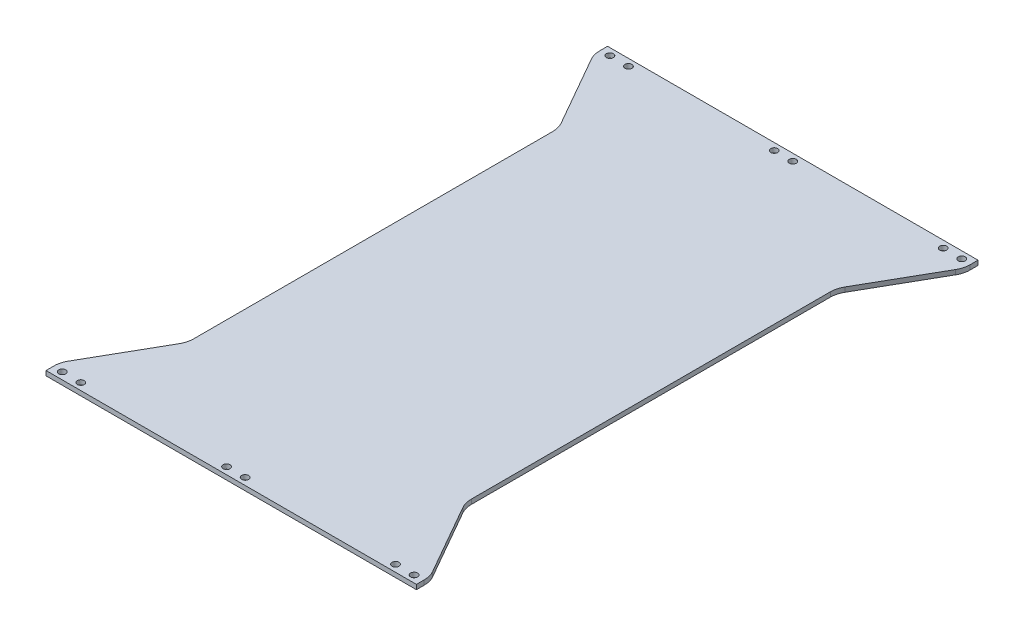
ISO-10303-21;
HEADER;
FILE_DESCRIPTION(('STEP AP214'),'2;1');
FILE_NAME('part.step','',(''),(''),'','','');
FILE_SCHEMA(('AUTOMOTIVE_DESIGN { 1 0 10303 214 1 1 1 1 }'));
ENDSEC;
DATA;
#1=APPLICATION_CONTEXT('core data for automotive mechanical design processes');
#2=APPLICATION_PROTOCOL_DEFINITION('international standard','automotive_design',2000,#1);
#3=PRODUCT_CONTEXT('',#1,'mechanical');
#4=PRODUCT('Part','Part','',(#3));
#5=PRODUCT_RELATED_PRODUCT_CATEGORY('part','',(#4));
#6=PRODUCT_DEFINITION_FORMATION('','',#4);
#7=PRODUCT_DEFINITION_CONTEXT('part definition',#1,'design');
#8=PRODUCT_DEFINITION('design','',#6,#7);
#9=PRODUCT_DEFINITION_SHAPE('','',#8);
#10=(LENGTH_UNIT() NAMED_UNIT(*) SI_UNIT(.MILLI.,.METRE.));
#11=(NAMED_UNIT(*) PLANE_ANGLE_UNIT() SI_UNIT($,.RADIAN.));
#12=(NAMED_UNIT(*) SI_UNIT($,.STERADIAN.) SOLID_ANGLE_UNIT());
#13=UNCERTAINTY_MEASURE_WITH_UNIT(LENGTH_MEASURE(1.E-05),#10,'distance_accuracy_value','');
#14=(GEOMETRIC_REPRESENTATION_CONTEXT(3) GLOBAL_UNCERTAINTY_ASSIGNED_CONTEXT((#13)) GLOBAL_UNIT_ASSIGNED_CONTEXT((#10,
#11,#12)) REPRESENTATION_CONTEXT('',''));
#15=CARTESIAN_POINT('',(0.,0.,0.));
#16=DIRECTION('',(0.,0.,1.));
#17=DIRECTION('',(1.,0.,0.));
#18=AXIS2_PLACEMENT_3D('',#15,#16,#17);
#19=CARTESIAN_POINT('',(0.,2.,0.));
#20=DIRECTION('',(0.,-1.,0.));
#21=DIRECTION('',(0.,0.,-1.));
#22=AXIS2_PLACEMENT_3D('',#19,#20,#21);
#23=PLANE('',#22);
#24=DIRECTION('',(-0.496138938356833,0.,0.86824314212446));
#25=VECTOR('',#24,1.);
#26=CARTESIAN_POINT('',(688.047893911136,2.,1712.91857928668));
#27=LINE('',#26,#25);
#28=CARTESIAN_POINT('',(706.730325332381,2.,1680.2243242995));
#29=VERTEX_POINT('',#28);
#30=CARTESIAN_POINT('',(689.365462489892,2.,1710.61283427386));
#31=VERTEX_POINT('',#30);
#32=EDGE_CURVE('E230',#29,#31,#27,.T.);
#33=ORIENTED_EDGE('',*,*,#32,.T.);
#34=CARTESIAN_POINT('',(698.047893911136,2.,1715.57422365742));
#35=DIRECTION('',(0.,-1.,0.));
#36=DIRECTION('',(0.,0.,-1.));
#37=AXIS2_PLACEMENT_3D('',#34,#35,#36);
#38=CIRCLE('',#37,10.);
#39=CARTESIAN_POINT('',(688.047893911136,2.,1715.57422365742));
#40=VERTEX_POINT('',#39);
#41=EDGE_CURVE('E332',#31,#40,#38,.F.);
#42=ORIENTED_EDGE('',*,*,#41,.T.);
#43=DIRECTION('',(0.,0.,1.));
#44=VECTOR('',#43,1.);
#45=CARTESIAN_POINT('',(688.047893911136,2.,1718.91857928668));
#46=LINE('',#45,#44);
#47=CARTESIAN_POINT('',(688.047893911136,2.,1718.91857928668));
#48=VERTEX_POINT('',#47);
#49=EDGE_CURVE('E233',#40,#48,#46,.T.);
#50=ORIENTED_EDGE('',*,*,#49,.T.);
#51=DIRECTION('',(1.,0.,0.));
#52=VECTOR('',#51,1.);
#53=CARTESIAN_POINT('',(688.047893911136,2.,1718.91857928668));
#54=LINE('',#53,#52);
#55=CARTESIAN_POINT('',(847.682893911136,2.,1718.91857928668));
#56=VERTEX_POINT('',#55);
#57=EDGE_CURVE('E236',#48,#56,#54,.T.);
#58=ORIENTED_EDGE('',*,*,#57,.T.);
#59=DIRECTION('',(0.,0.,-1.));
#60=VECTOR('',#59,1.);
#61=CARTESIAN_POINT('',(847.682893911136,2.,1718.91857928668));
#62=LINE('',#61,#60);
#63=CARTESIAN_POINT('',(847.682893911136,2.,1715.57422365742));
#64=VERTEX_POINT('',#63);
#65=EDGE_CURVE('E239',#56,#64,#62,.T.);
#66=ORIENTED_EDGE('',*,*,#65,.T.);
#67=CARTESIAN_POINT('',(837.682893911136,2.,1715.57422365742));
#68=DIRECTION('',(0.,-1.,0.));
#69=DIRECTION('',(0.,0.,-1.));
#70=AXIS2_PLACEMENT_3D('',#67,#68,#69);
#71=CIRCLE('',#70,10.);
#72=CARTESIAN_POINT('',(846.365325332381,2.,1710.61283427386));
#73=VERTEX_POINT('',#72);
#74=EDGE_CURVE('E329',#64,#73,#71,.F.);
#75=ORIENTED_EDGE('',*,*,#74,.T.);
#76=DIRECTION('',(-0.496138938356831,0.,-0.868243142124461));
#77=VECTOR('',#76,1.);
#78=CARTESIAN_POINT('',(847.682893911136,2.,1712.91857928668));
#79=LINE('',#78,#77);
#80=CARTESIAN_POINT('',(829.000462489892,2.,1680.2243242995));
#81=VERTEX_POINT('',#80);
#82=EDGE_CURVE('E285',#73,#81,#79,.T.);
#83=ORIENTED_EDGE('',*,*,#82,.T.);
#84=CARTESIAN_POINT('',(837.682893911136,2.,1675.26293491593));
#85=DIRECTION('',(0.,-1.,0.));
#86=DIRECTION('',(0.,0.,-1.));
#87=AXIS2_PLACEMENT_3D('',#84,#85,#86);
#88=CIRCLE('',#87,10.);
#89=CARTESIAN_POINT('',(827.682893911136,2.,1675.26293491593));
#90=VERTEX_POINT('',#89);
#91=EDGE_CURVE('E379',#81,#90,#88,.T.);
#92=ORIENTED_EDGE('',*,*,#91,.T.);
#93=DIRECTION('',(0.,0.,-1.));
#94=VECTOR('',#93,1.);
#95=CARTESIAN_POINT('',(827.682893911136,2.,1517.91857928668));
#96=LINE('',#95,#94);
#97=CARTESIAN_POINT('',(827.682893911136,2.,1520.57422365742));
#98=VERTEX_POINT('',#97);
#99=EDGE_CURVE('E446',#90,#98,#96,.T.);
#100=ORIENTED_EDGE('',*,*,#99,.T.);
#101=CARTESIAN_POINT('',(837.682893911136,2.,1520.57422365742));
#102=DIRECTION('',(0.,-1.,0.));
#103=DIRECTION('',(0.,0.,-1.));
#104=AXIS2_PLACEMENT_3D('',#101,#102,#103);
#105=CIRCLE('',#104,10.);
#106=CARTESIAN_POINT('',(829.000462489892,2.,1515.61283427386));
#107=VERTEX_POINT('',#106);
#108=EDGE_CURVE('E385',#98,#107,#105,.T.);
#109=ORIENTED_EDGE('',*,*,#108,.T.);
#110=DIRECTION('',(0.496138938356831,0.,-0.868243142124461));
#111=VECTOR('',#110,1.);
#112=CARTESIAN_POINT('',(847.682893911136,2.,1482.91857928668));
#113=LINE('',#112,#111);
#114=CARTESIAN_POINT('',(846.365325332381,2.,1485.2243242995));
#115=VERTEX_POINT('',#114);
#116=EDGE_CURVE('E200',#107,#115,#113,.T.);
#117=ORIENTED_EDGE('',*,*,#116,.T.);
#118=CARTESIAN_POINT('',(837.682893911136,2.,1480.26293491593));
#119=DIRECTION('',(0.,-1.,0.));
#120=DIRECTION('',(0.,0.,-1.));
#121=AXIS2_PLACEMENT_3D('',#118,#119,#120);
#122=CIRCLE('',#121,10.);
#123=CARTESIAN_POINT('',(847.682893911136,2.,1480.26293491593));
#124=VERTEX_POINT('',#123);
#125=EDGE_CURVE('E195',#115,#124,#122,.F.);
#126=ORIENTED_EDGE('',*,*,#125,.T.);
#127=DIRECTION('',(0.,0.,-1.));
#128=VECTOR('',#127,1.);
#129=CARTESIAN_POINT('',(847.682893911136,2.,1476.91857928668));
#130=LINE('',#129,#128);
#131=CARTESIAN_POINT('',(847.682893911136,2.,1476.91857928668));
#132=VERTEX_POINT('',#131);
#133=EDGE_CURVE('E185',#124,#132,#130,.T.);
#134=ORIENTED_EDGE('',*,*,#133,.T.);
#135=DIRECTION('',(-1.,0.,0.));
#136=VECTOR('',#135,1.);
#137=CARTESIAN_POINT('',(688.047893911136,2.,1476.91857928668));
#138=LINE('',#137,#136);
#139=CARTESIAN_POINT('',(688.047893911136,2.,1476.91857928668));
#140=VERTEX_POINT('',#139);
#141=EDGE_CURVE('E191',#132,#140,#138,.T.);
#142=ORIENTED_EDGE('',*,*,#141,.T.);
#143=DIRECTION('',(0.,0.,1.));
#144=VECTOR('',#143,1.);
#145=CARTESIAN_POINT('',(688.047893911136,2.,1476.91857928668));
#146=LINE('',#145,#144);
#147=CARTESIAN_POINT('',(688.047893911136,2.,1480.26293491593));
#148=VERTEX_POINT('',#147);
#149=EDGE_CURVE('E217',#140,#148,#146,.T.);
#150=ORIENTED_EDGE('',*,*,#149,.T.);
#151=CARTESIAN_POINT('',(698.047893911136,2.,1480.26293491593));
#152=DIRECTION('',(0.,-1.,0.));
#153=DIRECTION('',(0.,0.,-1.));
#154=AXIS2_PLACEMENT_3D('',#151,#152,#153);
#155=CIRCLE('',#154,10.);
#156=CARTESIAN_POINT('',(689.365462489891,2.,1485.2243242995));
#157=VERTEX_POINT('',#156);
#158=EDGE_CURVE('E324',#148,#157,#155,.F.);
#159=ORIENTED_EDGE('',*,*,#158,.T.);
#160=DIRECTION('',(0.496138938356831,0.,0.868243142124461));
#161=VECTOR('',#160,1.);
#162=CARTESIAN_POINT('',(688.047893911136,2.,1482.91857928668));
#163=LINE('',#162,#161);
#164=CARTESIAN_POINT('',(706.730325332381,2.,1515.61283427386));
#165=VERTEX_POINT('',#164);
#166=EDGE_CURVE('E220',#157,#165,#163,.T.);
#167=ORIENTED_EDGE('',*,*,#166,.T.);
#168=CARTESIAN_POINT('',(698.047893911136,2.,1520.57422365742));
#169=DIRECTION('',(0.,-1.,0.));
#170=DIRECTION('',(0.,0.,-1.));
#171=AXIS2_PLACEMENT_3D('',#168,#169,#170);
#172=CIRCLE('',#171,10.);
#173=CARTESIAN_POINT('',(708.047893911136,2.,1520.57422365742));
#174=VERTEX_POINT('',#173);
#175=EDGE_CURVE('E11',#165,#174,#172,.T.);
#176=ORIENTED_EDGE('',*,*,#175,.T.);
#177=DIRECTION('',(0.,0.,1.));
#178=VECTOR('',#177,1.);
#179=CARTESIAN_POINT('',(708.047893911136,2.,1517.91857928668));
#180=LINE('',#179,#178);
#181=CARTESIAN_POINT('',(708.047893911136,2.,1675.26293491593));
#182=VERTEX_POINT('',#181);
#183=EDGE_CURVE('E226',#174,#182,#180,.T.);
#184=ORIENTED_EDGE('',*,*,#183,.T.);
#185=CARTESIAN_POINT('',(698.047893911136,2.,1675.26293491593));
#186=DIRECTION('',(0.,-1.,0.));
#187=DIRECTION('',(0.,0.,-1.));
#188=AXIS2_PLACEMENT_3D('',#185,#186,#187);
#189=CIRCLE('',#188,10.);
#190=EDGE_CURVE('E373',#182,#29,#189,.T.);
#191=ORIENTED_EDGE('',*,*,#190,.T.);
#192=EDGE_LOOP('',(#33,#42,#50,#58,#66,#75,#83,#92,#100,#109,#117,#126,#134,#142,#150,#159,#167,
#176,#184,#191));
#193=FACE_BOUND('',#192,.T.);
#194=CARTESIAN_POINT('',(692.047893911136,2.,1715.91857928668));
#195=DIRECTION('',(0.,1.,0.));
#196=DIRECTION('',(0.,0.,-1.));
#197=AXIS2_PLACEMENT_3D('',#194,#195,#196);
#198=CIRCLE('',#197,1.50000000000011);
#199=CARTESIAN_POINT('',(692.047893911136,2.,1714.41857928668));
#200=VERTEX_POINT('',#199);
#201=EDGE_CURVE('E248',#200,#200,#198,.T.);
#202=ORIENTED_EDGE('',*,*,#201,.F.);
#203=EDGE_LOOP('',(#202));
#204=FACE_BOUND('',#203,.T.);
#205=CARTESIAN_POINT('',(700.047893911136,2.,1715.91857928668));
#206=DIRECTION('',(0.,1.,0.));
#207=DIRECTION('',(0.,0.,-1.));
#208=AXIS2_PLACEMENT_3D('',#205,#206,#207);
#209=CIRCLE('',#208,1.50000000000011);
#210=CARTESIAN_POINT('',(700.047893911136,2.,1714.41857928668));
#211=VERTEX_POINT('',#210);
#212=EDGE_CURVE('E458',#211,#211,#209,.T.);
#213=ORIENTED_EDGE('',*,*,#212,.F.);
#214=EDGE_LOOP('',(#213));
#215=FACE_BOUND('',#214,.T.);
#216=CARTESIAN_POINT('',(770.867893911136,2.,1715.91857928668));
#217=DIRECTION('',(0.,1.,0.));
#218=DIRECTION('',(0.,0.,-1.));
#219=AXIS2_PLACEMENT_3D('',#216,#217,#218);
#220=CIRCLE('',#219,1.50000000000011);
#221=CARTESIAN_POINT('',(770.867893911136,2.,1714.41857928668));
#222=VERTEX_POINT('',#221);
#223=EDGE_CURVE('E466',#222,#222,#220,.T.);
#224=ORIENTED_EDGE('',*,*,#223,.F.);
#225=EDGE_LOOP('',(#224));
#226=FACE_BOUND('',#225,.T.);
#227=CARTESIAN_POINT('',(762.867893911136,2.,1715.91857928668));
#228=DIRECTION('',(0.,1.,0.));
#229=DIRECTION('',(0.,0.,-1.));
#230=AXIS2_PLACEMENT_3D('',#227,#228,#229);
#231=CIRCLE('',#230,1.50000000000011);
#232=CARTESIAN_POINT('',(762.867893911136,2.,1714.41857928668));
#233=VERTEX_POINT('',#232);
#234=EDGE_CURVE('E474',#233,#233,#231,.T.);
#235=ORIENTED_EDGE('',*,*,#234,.F.);
#236=EDGE_LOOP('',(#235));
#237=FACE_BOUND('',#236,.T.);
#238=CARTESIAN_POINT('',(835.682893911136,2.,1715.91857928668));
#239=DIRECTION('',(0.,1.,0.));
#240=DIRECTION('',(0.,0.,-1.));
#241=AXIS2_PLACEMENT_3D('',#238,#239,#240);
#242=CIRCLE('',#241,1.50000000000011);
#243=CARTESIAN_POINT('',(835.682893911136,2.,1714.41857928668));
#244=VERTEX_POINT('',#243);
#245=EDGE_CURVE('E482',#244,#244,#242,.T.);
#246=ORIENTED_EDGE('',*,*,#245,.F.);
#247=EDGE_LOOP('',(#246));
#248=FACE_BOUND('',#247,.T.);
#249=CARTESIAN_POINT('',(843.682893911136,2.,1715.91857928668));
#250=DIRECTION('',(0.,1.,0.));
#251=DIRECTION('',(0.,0.,-1.));
#252=AXIS2_PLACEMENT_3D('',#249,#250,#251);
#253=CIRCLE('',#252,1.50000000000011);
#254=CARTESIAN_POINT('',(843.682893911136,2.,1714.41857928668));
#255=VERTEX_POINT('',#254);
#256=EDGE_CURVE('E490',#255,#255,#253,.T.);
#257=ORIENTED_EDGE('',*,*,#256,.F.);
#258=EDGE_LOOP('',(#257));
#259=FACE_BOUND('',#258,.T.);
#260=CARTESIAN_POINT('',(843.682893911136,2.,1479.91857928668));
#261=DIRECTION('',(0.,1.,0.));
#262=DIRECTION('',(0.,0.,1.));
#263=AXIS2_PLACEMENT_3D('',#260,#261,#262);
#264=CIRCLE('',#263,1.50000000000011);
#265=CARTESIAN_POINT('',(843.682893911136,2.,1481.41857928668));
#266=VERTEX_POINT('',#265);
#267=EDGE_CURVE('E498',#266,#266,#264,.T.);
#268=ORIENTED_EDGE('',*,*,#267,.F.);
#269=EDGE_LOOP('',(#268));
#270=FACE_BOUND('',#269,.T.);
#271=CARTESIAN_POINT('',(835.682893911136,2.,1479.91857928668));
#272=DIRECTION('',(0.,1.,0.));
#273=DIRECTION('',(0.,0.,1.));
#274=AXIS2_PLACEMENT_3D('',#271,#272,#273);
#275=CIRCLE('',#274,1.50000000000011);
#276=CARTESIAN_POINT('',(835.682893911136,2.,1481.41857928668));
#277=VERTEX_POINT('',#276);
#278=EDGE_CURVE('E506',#277,#277,#275,.T.);
#279=ORIENTED_EDGE('',*,*,#278,.F.);
#280=EDGE_LOOP('',(#279));
#281=FACE_BOUND('',#280,.T.);
#282=CARTESIAN_POINT('',(762.867893911136,2.,1479.91857928668));
#283=DIRECTION('',(0.,1.,0.));
#284=DIRECTION('',(0.,0.,1.));
#285=AXIS2_PLACEMENT_3D('',#282,#283,#284);
#286=CIRCLE('',#285,1.50000000000011);
#287=CARTESIAN_POINT('',(762.867893911136,2.,1481.41857928668));
#288=VERTEX_POINT('',#287);
#289=EDGE_CURVE('E514',#288,#288,#286,.T.);
#290=ORIENTED_EDGE('',*,*,#289,.F.);
#291=EDGE_LOOP('',(#290));
#292=FACE_BOUND('',#291,.T.);
#293=CARTESIAN_POINT('',(770.867893911136,2.,1479.91857928668));
#294=DIRECTION('',(0.,1.,0.));
#295=DIRECTION('',(0.,0.,1.));
#296=AXIS2_PLACEMENT_3D('',#293,#294,#295);
#297=CIRCLE('',#296,1.50000000000011);
#298=CARTESIAN_POINT('',(770.867893911136,2.,1481.41857928668));
#299=VERTEX_POINT('',#298);
#300=EDGE_CURVE('E522',#299,#299,#297,.T.);
#301=ORIENTED_EDGE('',*,*,#300,.F.);
#302=EDGE_LOOP('',(#301));
#303=FACE_BOUND('',#302,.T.);
#304=CARTESIAN_POINT('',(700.047893911136,2.,1479.91857928668));
#305=DIRECTION('',(0.,1.,0.));
#306=DIRECTION('',(0.,0.,1.));
#307=AXIS2_PLACEMENT_3D('',#304,#305,#306);
#308=CIRCLE('',#307,1.50000000000011);
#309=CARTESIAN_POINT('',(700.047893911136,2.,1481.41857928668));
#310=VERTEX_POINT('',#309);
#311=EDGE_CURVE('E530',#310,#310,#308,.T.);
#312=ORIENTED_EDGE('',*,*,#311,.F.);
#313=EDGE_LOOP('',(#312));
#314=FACE_BOUND('',#313,.T.);
#315=CARTESIAN_POINT('',(692.047893911136,2.,1479.91857928668));
#316=DIRECTION('',(0.,1.,0.));
#317=DIRECTION('',(0.,0.,1.));
#318=AXIS2_PLACEMENT_3D('',#315,#316,#317);
#319=CIRCLE('',#318,1.50000000000011);
#320=CARTESIAN_POINT('',(692.047893911136,2.,1481.41857928668));
#321=VERTEX_POINT('',#320);
#322=EDGE_CURVE('E538',#321,#321,#319,.T.);
#323=ORIENTED_EDGE('',*,*,#322,.F.);
#324=EDGE_LOOP('',(#323));
#325=FACE_BOUND('',#324,.T.);
#326=ADVANCED_FACE('F45',(#193,#204,#215,#226,#237,#248,#259,#270,#281,#292,#303,#314,#325),#23,.F.);
#327=CARTESIAN_POINT('',(0.,0.,0.));
#328=DIRECTION('',(0.,-1.,0.));
#329=DIRECTION('',(0.,0.,-1.));
#330=AXIS2_PLACEMENT_3D('',#327,#328,#329);
#331=PLANE('',#330);
#332=CARTESIAN_POINT('',(700.047893911136,0.,1479.91857928668));
#333=DIRECTION('',(0.,1.,0.));
#334=DIRECTION('',(0.,0.,1.));
#335=AXIS2_PLACEMENT_3D('',#332,#333,#334);
#336=CIRCLE('',#335,1.50000000000011);
#337=CARTESIAN_POINT('',(700.047893911136,0.,1481.41857928668));
#338=VERTEX_POINT('',#337);
#339=EDGE_CURVE('E534',#338,#338,#336,.T.);
#340=ORIENTED_EDGE('',*,*,#339,.T.);
#341=EDGE_LOOP('',(#340));
#342=FACE_BOUND('',#341,.T.);
#343=CARTESIAN_POINT('',(762.867893911136,0.,1479.91857928668));
#344=DIRECTION('',(0.,1.,0.));
#345=DIRECTION('',(0.,0.,1.));
#346=AXIS2_PLACEMENT_3D('',#343,#344,#345);
#347=CIRCLE('',#346,1.50000000000011);
#348=CARTESIAN_POINT('',(762.867893911136,0.,1481.41857928668));
#349=VERTEX_POINT('',#348);
#350=EDGE_CURVE('E518',#349,#349,#347,.T.);
#351=ORIENTED_EDGE('',*,*,#350,.T.);
#352=EDGE_LOOP('',(#351));
#353=FACE_BOUND('',#352,.T.);
#354=CARTESIAN_POINT('',(843.682893911136,0.,1479.91857928668));
#355=DIRECTION('',(0.,1.,0.));
#356=DIRECTION('',(0.,0.,1.));
#357=AXIS2_PLACEMENT_3D('',#354,#355,#356);
#358=CIRCLE('',#357,1.50000000000011);
#359=CARTESIAN_POINT('',(843.682893911136,0.,1481.41857928668));
#360=VERTEX_POINT('',#359);
#361=EDGE_CURVE('E502',#360,#360,#358,.T.);
#362=ORIENTED_EDGE('',*,*,#361,.T.);
#363=EDGE_LOOP('',(#362));
#364=FACE_BOUND('',#363,.T.);
#365=CARTESIAN_POINT('',(835.682893911136,0.,1715.91857928668));
#366=DIRECTION('',(0.,1.,0.));
#367=DIRECTION('',(0.,0.,-1.));
#368=AXIS2_PLACEMENT_3D('',#365,#366,#367);
#369=CIRCLE('',#368,1.50000000000011);
#370=CARTESIAN_POINT('',(835.682893911136,0.,1714.41857928668));
#371=VERTEX_POINT('',#370);
#372=EDGE_CURVE('E486',#371,#371,#369,.T.);
#373=ORIENTED_EDGE('',*,*,#372,.T.);
#374=EDGE_LOOP('',(#373));
#375=FACE_BOUND('',#374,.T.);
#376=CARTESIAN_POINT('',(770.867893911136,0.,1715.91857928668));
#377=DIRECTION('',(0.,1.,0.));
#378=DIRECTION('',(0.,0.,-1.));
#379=AXIS2_PLACEMENT_3D('',#376,#377,#378);
#380=CIRCLE('',#379,1.50000000000011);
#381=CARTESIAN_POINT('',(770.867893911136,0.,1714.41857928668));
#382=VERTEX_POINT('',#381);
#383=EDGE_CURVE('E470',#382,#382,#380,.T.);
#384=ORIENTED_EDGE('',*,*,#383,.T.);
#385=EDGE_LOOP('',(#384));
#386=FACE_BOUND('',#385,.T.);
#387=CARTESIAN_POINT('',(692.047893911136,0.,1715.91857928668));
#388=DIRECTION('',(0.,1.,0.));
#389=DIRECTION('',(0.,0.,-1.));
#390=AXIS2_PLACEMENT_3D('',#387,#388,#389);
#391=CIRCLE('',#390,1.50000000000011);
#392=CARTESIAN_POINT('',(692.047893911136,0.,1714.41857928668));
#393=VERTEX_POINT('',#392);
#394=EDGE_CURVE('E454',#393,#393,#391,.T.);
#395=ORIENTED_EDGE('',*,*,#394,.T.);
#396=EDGE_LOOP('',(#395));
#397=FACE_BOUND('',#396,.T.);
#398=DIRECTION('',(0.,0.,1.));
#399=VECTOR('',#398,1.);
#400=CARTESIAN_POINT('',(688.047893911136,0.,1718.91857928668));
#401=LINE('',#400,#399);
#402=CARTESIAN_POINT('',(688.047893911136,0.,1715.57422365742));
#403=VERTEX_POINT('',#402);
#404=CARTESIAN_POINT('',(688.047893911136,0.,1718.91857928668));
#405=VERTEX_POINT('',#404);
#406=EDGE_CURVE('E276',#403,#405,#401,.T.);
#407=ORIENTED_EDGE('',*,*,#406,.F.);
#408=CARTESIAN_POINT('',(698.047893911136,0.,1715.57422365742));
#409=DIRECTION('',(0.,-1.,0.));
#410=DIRECTION('',(0.,0.,-1.));
#411=AXIS2_PLACEMENT_3D('',#408,#409,#410);
#412=CIRCLE('',#411,10.);
#413=CARTESIAN_POINT('',(689.365462489892,0.,1710.61283427386));
#414=VERTEX_POINT('',#413);
#415=EDGE_CURVE('E321',#403,#414,#412,.T.);
#416=ORIENTED_EDGE('',*,*,#415,.T.);
#417=DIRECTION('',(-0.496138938356833,0.,0.86824314212446));
#418=VECTOR('',#417,1.);
#419=CARTESIAN_POINT('',(688.047893911136,0.,1712.91857928668));
#420=LINE('',#419,#418);
#421=CARTESIAN_POINT('',(706.730325332381,0.,1680.2243242995));
#422=VERTEX_POINT('',#421);
#423=EDGE_CURVE('E272',#422,#414,#420,.T.);
#424=ORIENTED_EDGE('',*,*,#423,.F.);
#425=CARTESIAN_POINT('',(698.047893911136,0.,1675.26293491593));
#426=DIRECTION('',(0.,-1.,0.));
#427=DIRECTION('',(0.,0.,-1.));
#428=AXIS2_PLACEMENT_3D('',#425,#426,#427);
#429=CIRCLE('',#428,10.);
#430=CARTESIAN_POINT('',(708.047893911136,0.,1675.26293491593));
#431=VERTEX_POINT('',#430);
#432=EDGE_CURVE('E370',#422,#431,#429,.F.);
#433=ORIENTED_EDGE('',*,*,#432,.T.);
#434=DIRECTION('',(0.,0.,1.));
#435=VECTOR('',#434,1.);
#436=CARTESIAN_POINT('',(708.047893911136,0.,1517.91857928668));
#437=LINE('',#436,#435);
#438=CARTESIAN_POINT('',(708.047893911136,0.,1520.57422365742));
#439=VERTEX_POINT('',#438);
#440=EDGE_CURVE('E268',#439,#431,#437,.T.);
#441=ORIENTED_EDGE('',*,*,#440,.F.);
#442=CARTESIAN_POINT('',(698.047893911136,0.,1520.57422365742));
#443=DIRECTION('',(0.,-1.,0.));
#444=DIRECTION('',(0.,0.,-1.));
#445=AXIS2_PLACEMENT_3D('',#442,#443,#444);
#446=CIRCLE('',#445,10.);
#447=CARTESIAN_POINT('',(706.730325332381,0.,1515.61283427386));
#448=VERTEX_POINT('',#447);
#449=EDGE_CURVE('E54',#439,#448,#446,.F.);
#450=ORIENTED_EDGE('',*,*,#449,.T.);
#451=DIRECTION('',(0.496138938356831,0.,0.868243142124461));
#452=VECTOR('',#451,1.);
#453=CARTESIAN_POINT('',(688.047893911136,0.,1482.91857928668));
#454=LINE('',#453,#452);
#455=CARTESIAN_POINT('',(689.365462489891,0.,1485.2243242995));
#456=VERTEX_POINT('',#455);
#457=EDGE_CURVE('E265',#456,#448,#454,.T.);
#458=ORIENTED_EDGE('',*,*,#457,.F.);
#459=CARTESIAN_POINT('',(698.047893911136,0.,1480.26293491593));
#460=DIRECTION('',(0.,-1.,0.));
#461=DIRECTION('',(0.,0.,-1.));
#462=AXIS2_PLACEMENT_3D('',#459,#460,#461);
#463=CIRCLE('',#462,10.);
#464=CARTESIAN_POINT('',(688.047893911136,0.,1480.26293491593));
#465=VERTEX_POINT('',#464);
#466=EDGE_CURVE('E312',#456,#465,#463,.T.);
#467=ORIENTED_EDGE('',*,*,#466,.T.);
#468=DIRECTION('',(0.,0.,1.));
#469=VECTOR('',#468,1.);
#470=CARTESIAN_POINT('',(688.047893911136,0.,1476.91857928668));
#471=LINE('',#470,#469);
#472=CARTESIAN_POINT('',(688.047893911136,0.,1476.91857928668));
#473=VERTEX_POINT('',#472);
#474=EDGE_CURVE('E261',#473,#465,#471,.T.);
#475=ORIENTED_EDGE('',*,*,#474,.F.);
#476=DIRECTION('',(-1.,0.,0.));
#477=VECTOR('',#476,1.);
#478=CARTESIAN_POINT('',(688.047893911136,0.,1476.91857928668));
#479=LINE('',#478,#477);
#480=CARTESIAN_POINT('',(847.682893911136,0.,1476.91857928668));
#481=VERTEX_POINT('',#480);
#482=EDGE_CURVE('E258',#481,#473,#479,.T.);
#483=ORIENTED_EDGE('',*,*,#482,.F.);
#484=DIRECTION('',(0.,0.,-1.));
#485=VECTOR('',#484,1.);
#486=CARTESIAN_POINT('',(847.682893911136,0.,1476.91857928668));
#487=LINE('',#486,#485);
#488=CARTESIAN_POINT('',(847.682893911136,0.,1480.26293491593));
#489=VERTEX_POINT('',#488);
#490=EDGE_CURVE('E206',#489,#481,#487,.T.);
#491=ORIENTED_EDGE('',*,*,#490,.F.);
#492=CARTESIAN_POINT('',(837.682893911136,0.,1480.26293491593));
#493=DIRECTION('',(0.,-1.,0.));
#494=DIRECTION('',(0.,0.,-1.));
#495=AXIS2_PLACEMENT_3D('',#492,#493,#494);
#496=CIRCLE('',#495,10.);
#497=CARTESIAN_POINT('',(846.365325332381,0.,1485.2243242995));
#498=VERTEX_POINT('',#497);
#499=EDGE_CURVE('E315',#489,#498,#496,.T.);
#500=ORIENTED_EDGE('',*,*,#499,.T.);
#501=DIRECTION('',(0.496138938356831,0.,-0.868243142124461));
#502=VECTOR('',#501,1.);
#503=CARTESIAN_POINT('',(847.682893911136,0.,1482.91857928668));
#504=LINE('',#503,#502);
#505=CARTESIAN_POINT('',(829.000462489892,0.,1515.61283427386));
#506=VERTEX_POINT('',#505);
#507=EDGE_CURVE('E252',#506,#498,#504,.T.);
#508=ORIENTED_EDGE('',*,*,#507,.F.);
#509=CARTESIAN_POINT('',(837.682893911136,0.,1520.57422365742));
#510=DIRECTION('',(0.,-1.,0.));
#511=DIRECTION('',(0.,0.,-1.));
#512=AXIS2_PLACEMENT_3D('',#509,#510,#511);
#513=CIRCLE('',#512,10.);
#514=CARTESIAN_POINT('',(827.682893911136,0.,1520.57422365742));
#515=VERTEX_POINT('',#514);
#516=EDGE_CURVE('E382',#506,#515,#513,.F.);
#517=ORIENTED_EDGE('',*,*,#516,.T.);
#518=DIRECTION('',(0.,0.,-1.));
#519=VECTOR('',#518,1.);
#520=CARTESIAN_POINT('',(827.682893911136,0.,1517.91857928668));
#521=LINE('',#520,#519);
#522=CARTESIAN_POINT('',(827.682893911136,0.,1675.26293491593));
#523=VERTEX_POINT('',#522);
#524=EDGE_CURVE('E247',#523,#515,#521,.T.);
#525=ORIENTED_EDGE('',*,*,#524,.F.);
#526=CARTESIAN_POINT('',(837.682893911136,0.,1675.26293491593));
#527=DIRECTION('',(0.,-1.,0.));
#528=DIRECTION('',(0.,0.,-1.));
#529=AXIS2_PLACEMENT_3D('',#526,#527,#528);
#530=CIRCLE('',#529,10.);
#531=CARTESIAN_POINT('',(829.000462489892,0.,1680.2243242995));
#532=VERTEX_POINT('',#531);
#533=EDGE_CURVE('E376',#523,#532,#530,.F.);
#534=ORIENTED_EDGE('',*,*,#533,.T.);
#535=DIRECTION('',(-0.496138938356831,0.,-0.868243142124461));
#536=VECTOR('',#535,1.);
#537=CARTESIAN_POINT('',(847.682893911136,0.,1712.91857928668));
#538=LINE('',#537,#536);
#539=CARTESIAN_POINT('',(846.365325332381,0.,1710.61283427386));
#540=VERTEX_POINT('',#539);
#541=EDGE_CURVE('E243',#540,#532,#538,.T.);
#542=ORIENTED_EDGE('',*,*,#541,.F.);
#543=CARTESIAN_POINT('',(837.682893911136,0.,1715.57422365742));
#544=DIRECTION('',(0.,-1.,0.));
#545=DIRECTION('',(0.,0.,-1.));
#546=AXIS2_PLACEMENT_3D('',#543,#544,#545);
#547=CIRCLE('',#546,10.);
#548=CARTESIAN_POINT('',(847.682893911136,0.,1715.57422365742));
#549=VERTEX_POINT('',#548);
#550=EDGE_CURVE('E318',#540,#549,#547,.T.);
#551=ORIENTED_EDGE('',*,*,#550,.T.);
#552=DIRECTION('',(0.,0.,-1.));
#553=VECTOR('',#552,1.);
#554=CARTESIAN_POINT('',(847.682893911136,0.,1718.91857928668));
#555=LINE('',#554,#553);
#556=CARTESIAN_POINT('',(847.682893911136,0.,1718.91857928668));
#557=VERTEX_POINT('',#556);
#558=EDGE_CURVE('E282',#557,#549,#555,.T.);
#559=ORIENTED_EDGE('',*,*,#558,.F.);
#560=DIRECTION('',(1.,0.,0.));
#561=VECTOR('',#560,1.);
#562=CARTESIAN_POINT('',(688.047893911136,0.,1718.91857928668));
#563=LINE('',#562,#561);
#564=EDGE_CURVE('E279',#405,#557,#563,.T.);
#565=ORIENTED_EDGE('',*,*,#564,.F.);
#566=EDGE_LOOP('',(#407,#416,#424,#433,#441,#450,#458,#467,#475,#483,#491,#500,#508,#517,#525,
#534,#542,#551,#559,#565));
#567=FACE_BOUND('',#566,.T.);
#568=CARTESIAN_POINT('',(700.047893911136,0.,1715.91857928668));
#569=DIRECTION('',(0.,1.,0.));
#570=DIRECTION('',(0.,0.,-1.));
#571=AXIS2_PLACEMENT_3D('',#568,#569,#570);
#572=CIRCLE('',#571,1.50000000000011);
#573=CARTESIAN_POINT('',(700.047893911136,0.,1714.41857928668));
#574=VERTEX_POINT('',#573);
#575=EDGE_CURVE('E462',#574,#574,#572,.T.);
#576=ORIENTED_EDGE('',*,*,#575,.T.);
#577=EDGE_LOOP('',(#576));
#578=FACE_BOUND('',#577,.T.);
#579=CARTESIAN_POINT('',(762.867893911136,0.,1715.91857928668));
#580=DIRECTION('',(0.,1.,0.));
#581=DIRECTION('',(0.,0.,-1.));
#582=AXIS2_PLACEMENT_3D('',#579,#580,#581);
#583=CIRCLE('',#582,1.50000000000011);
#584=CARTESIAN_POINT('',(762.867893911136,0.,1714.41857928668));
#585=VERTEX_POINT('',#584);
#586=EDGE_CURVE('E478',#585,#585,#583,.T.);
#587=ORIENTED_EDGE('',*,*,#586,.T.);
#588=EDGE_LOOP('',(#587));
#589=FACE_BOUND('',#588,.T.);
#590=CARTESIAN_POINT('',(843.682893911136,0.,1715.91857928668));
#591=DIRECTION('',(0.,1.,0.));
#592=DIRECTION('',(0.,0.,-1.));
#593=AXIS2_PLACEMENT_3D('',#590,#591,#592);
#594=CIRCLE('',#593,1.50000000000011);
#595=CARTESIAN_POINT('',(843.682893911136,0.,1714.41857928668));
#596=VERTEX_POINT('',#595);
#597=EDGE_CURVE('E494',#596,#596,#594,.T.);
#598=ORIENTED_EDGE('',*,*,#597,.T.);
#599=EDGE_LOOP('',(#598));
#600=FACE_BOUND('',#599,.T.);
#601=CARTESIAN_POINT('',(835.682893911136,0.,1479.91857928668));
#602=DIRECTION('',(0.,1.,0.));
#603=DIRECTION('',(0.,0.,1.));
#604=AXIS2_PLACEMENT_3D('',#601,#602,#603);
#605=CIRCLE('',#604,1.50000000000011);
#606=CARTESIAN_POINT('',(835.682893911136,0.,1481.41857928668));
#607=VERTEX_POINT('',#606);
#608=EDGE_CURVE('E510',#607,#607,#605,.T.);
#609=ORIENTED_EDGE('',*,*,#608,.T.);
#610=EDGE_LOOP('',(#609));
#611=FACE_BOUND('',#610,.T.);
#612=CARTESIAN_POINT('',(770.867893911136,0.,1479.91857928668));
#613=DIRECTION('',(0.,1.,0.));
#614=DIRECTION('',(0.,0.,1.));
#615=AXIS2_PLACEMENT_3D('',#612,#613,#614);
#616=CIRCLE('',#615,1.50000000000011);
#617=CARTESIAN_POINT('',(770.867893911136,0.,1481.41857928668));
#618=VERTEX_POINT('',#617);
#619=EDGE_CURVE('E526',#618,#618,#616,.T.);
#620=ORIENTED_EDGE('',*,*,#619,.T.);
#621=EDGE_LOOP('',(#620));
#622=FACE_BOUND('',#621,.T.);
#623=CARTESIAN_POINT('',(692.047893911136,0.,1479.91857928668));
#624=DIRECTION('',(0.,1.,0.));
#625=DIRECTION('',(0.,0.,1.));
#626=AXIS2_PLACEMENT_3D('',#623,#624,#625);
#627=CIRCLE('',#626,1.50000000000011);
#628=CARTESIAN_POINT('',(692.047893911136,0.,1481.41857928668));
#629=VERTEX_POINT('',#628);
#630=EDGE_CURVE('E542',#629,#629,#627,.T.);
#631=ORIENTED_EDGE('',*,*,#630,.T.);
#632=EDGE_LOOP('',(#631));
#633=FACE_BOUND('',#632,.T.);
#634=ADVANCED_FACE('F392',(#342,#353,#364,#375,#386,#397,#567,#578,#589,#600,#611,#622,#633),
#331,.T.);
#635=CARTESIAN_POINT('',(847.682893911136,2.,1712.91857928668));
#636=DIRECTION('',(-0.868243142124461,0.,0.496138938356831));
#637=DIRECTION('',(0.496138938356831,0.,0.868243142124461));
#638=AXIS2_PLACEMENT_3D('',#635,#636,#637);
#639=PLANE('',#638);
#640=ORIENTED_EDGE('',*,*,#82,.F.);
#641=DIRECTION('',(0.,-1.,0.));
#642=VECTOR('',#641,1.);
#643=CARTESIAN_POINT('',(846.365325332381,2.,1710.61283427386));
#644=LINE('',#643,#642);
#645=EDGE_CURVE('E338',#73,#540,#644,.T.);
#646=ORIENTED_EDGE('',*,*,#645,.T.);
#647=ORIENTED_EDGE('',*,*,#541,.T.);
#648=DIRECTION('',(0.,-1.,0.));
#649=VECTOR('',#648,1.);
#650=CARTESIAN_POINT('',(829.000462489892,2.,1680.2243242995));
#651=LINE('',#650,#649);
#652=EDGE_CURVE('E335',#532,#81,#651,.F.);
#653=ORIENTED_EDGE('',*,*,#652,.T.);
#654=EDGE_LOOP('',(#640,#646,#647,#653));
#655=FACE_BOUND('',#654,.T.);
#656=ADVANCED_FACE('F433',(#655),#639,.F.);
#657=CARTESIAN_POINT('',(827.682893911136,2.,1517.91857928668));
#658=DIRECTION('',(-1.,0.,0.));
#659=DIRECTION('',(0.,0.,1.));
#660=AXIS2_PLACEMENT_3D('',#657,#658,#659);
#661=PLANE('',#660);
#662=ORIENTED_EDGE('',*,*,#99,.F.);
#663=DIRECTION('',(0.,-1.,0.));
#664=VECTOR('',#663,1.);
#665=CARTESIAN_POINT('',(827.682893911136,0.,1675.26293491593));
#666=LINE('',#665,#664);
#667=EDGE_CURVE('E347',#90,#523,#666,.T.);
#668=ORIENTED_EDGE('',*,*,#667,.T.);
#669=ORIENTED_EDGE('',*,*,#524,.T.);
#670=DIRECTION('',(0.,-1.,0.));
#671=VECTOR('',#670,1.);
#672=CARTESIAN_POINT('',(827.682893911136,2.,1520.57422365742));
#673=LINE('',#672,#671);
#674=EDGE_CURVE('E344',#515,#98,#673,.F.);
#675=ORIENTED_EDGE('',*,*,#674,.T.);
#676=EDGE_LOOP('',(#662,#668,#669,#675));
#677=FACE_BOUND('',#676,.T.);
#678=ADVANCED_FACE('F443',(#677),#661,.F.);
#679=CARTESIAN_POINT('',(847.682893911136,2.,1482.91857928668));
#680=DIRECTION('',(-0.868243142124461,0.,-0.496138938356831));
#681=DIRECTION('',(-0.496138938356831,0.,0.868243142124461));
#682=AXIS2_PLACEMENT_3D('',#679,#680,#681);
#683=PLANE('',#682);
#684=ORIENTED_EDGE('',*,*,#507,.T.);
#685=DIRECTION('',(0.,-1.,0.));
#686=VECTOR('',#685,1.);
#687=CARTESIAN_POINT('',(846.365325332381,2.,1485.2243242995));
#688=LINE('',#687,#686);
#689=EDGE_CURVE('E358',#498,#115,#688,.F.);
#690=ORIENTED_EDGE('',*,*,#689,.T.);
#691=ORIENTED_EDGE('',*,*,#116,.F.);
#692=DIRECTION('',(0.,-1.,0.));
#693=VECTOR('',#692,1.);
#694=CARTESIAN_POINT('',(829.000462489892,0.,1515.61283427386));
#695=LINE('',#694,#693);
#696=EDGE_CURVE('E354',#107,#506,#695,.T.);
#697=ORIENTED_EDGE('',*,*,#696,.T.);
#698=EDGE_LOOP('',(#684,#690,#691,#697));
#699=FACE_BOUND('',#698,.T.);
#700=ADVANCED_FACE('F586',(#699),#683,.F.);
#701=CARTESIAN_POINT('',(847.682893911136,2.,1476.91857928668));
#702=DIRECTION('',(-1.,0.,0.));
#703=DIRECTION('',(0.,0.,1.));
#704=AXIS2_PLACEMENT_3D('',#701,#702,#703);
#705=PLANE('',#704);
#706=ORIENTED_EDGE('',*,*,#133,.F.);
#707=DIRECTION('',(0.,-1.,0.));
#708=VECTOR('',#707,1.);
#709=CARTESIAN_POINT('',(847.682893911136,2.,1480.26293491593));
#710=LINE('',#709,#708);
#711=EDGE_CURVE('E351',#124,#489,#710,.T.);
#712=ORIENTED_EDGE('',*,*,#711,.T.);
#713=ORIENTED_EDGE('',*,*,#490,.T.);
#714=DIRECTION('',(0.,-1.,0.));
#715=VECTOR('',#714,1.);
#716=CARTESIAN_POINT('',(847.682893911136,2.,1476.91857928668));
#717=LINE('',#716,#715);
#718=EDGE_CURVE('E203',#132,#481,#717,.T.);
#719=ORIENTED_EDGE('',*,*,#718,.F.);
#720=EDGE_LOOP('',(#706,#712,#713,#719));
#721=FACE_BOUND('',#720,.T.);
#722=ADVANCED_FACE('F204',(#721),#705,.F.);
#723=CARTESIAN_POINT('',(688.047893911136,2.,1476.91857928668));
#724=DIRECTION('',(0.,0.,1.));
#725=DIRECTION('',(1.,0.,0.));
#726=AXIS2_PLACEMENT_3D('',#723,#724,#725);
#727=PLANE('',#726);
#728=ORIENTED_EDGE('',*,*,#482,.T.);
#729=DIRECTION('',(0.,-1.,0.));
#730=VECTOR('',#729,1.);
#731=CARTESIAN_POINT('',(688.047893911136,2.,1476.91857928668));
#732=LINE('',#731,#730);
#733=EDGE_CURVE('E211',#140,#473,#732,.T.);
#734=ORIENTED_EDGE('',*,*,#733,.F.);
#735=ORIENTED_EDGE('',*,*,#141,.F.);
#736=ORIENTED_EDGE('',*,*,#718,.T.);
#737=EDGE_LOOP('',(#728,#734,#735,#736));
#738=FACE_BOUND('',#737,.T.);
#739=ADVANCED_FACE('F213',(#738),#727,.F.);
#740=CARTESIAN_POINT('',(688.047893911136,2.,1476.91857928668));
#741=DIRECTION('',(1.,0.,0.));
#742=DIRECTION('',(0.,0.,-1.));
#743=AXIS2_PLACEMENT_3D('',#740,#741,#742);
#744=PLANE('',#743);
#745=ORIENTED_EDGE('',*,*,#474,.T.);
#746=DIRECTION('',(0.,-1.,0.));
#747=VECTOR('',#746,1.);
#748=CARTESIAN_POINT('',(688.047893911136,2.,1480.26293491593));
#749=LINE('',#748,#747);
#750=EDGE_CURVE('E367',#465,#148,#749,.F.);
#751=ORIENTED_EDGE('',*,*,#750,.T.);
#752=ORIENTED_EDGE('',*,*,#149,.F.);
#753=ORIENTED_EDGE('',*,*,#733,.T.);
#754=EDGE_LOOP('',(#745,#751,#752,#753));
#755=FACE_BOUND('',#754,.T.);
#756=ADVANCED_FACE('F578',(#755),#744,.F.);
#757=CARTESIAN_POINT('',(688.047893911136,2.,1482.91857928668));
#758=DIRECTION('',(0.868243142124461,0.,-0.496138938356831));
#759=DIRECTION('',(-0.496138938356831,0.,-0.868243142124461));
#760=AXIS2_PLACEMENT_3D('',#757,#758,#759);
#761=PLANE('',#760);
#762=ORIENTED_EDGE('',*,*,#166,.F.);
#763=DIRECTION('',(0.,-1.,0.));
#764=VECTOR('',#763,1.);
#765=CARTESIAN_POINT('',(689.365462489891,2.,1485.2243242995));
#766=LINE('',#765,#764);
#767=EDGE_CURVE('E363',#157,#456,#766,.T.);
#768=ORIENTED_EDGE('',*,*,#767,.T.);
#769=ORIENTED_EDGE('',*,*,#457,.T.);
#770=DIRECTION('',(0.,-1.,0.));
#771=VECTOR('',#770,1.);
#772=CARTESIAN_POINT('',(706.730325332381,2.,1515.61283427386));
#773=LINE('',#772,#771);
#774=EDGE_CURVE('E69',#448,#165,#773,.F.);
#775=ORIENTED_EDGE('',*,*,#774,.T.);
#776=EDGE_LOOP('',(#762,#768,#769,#775));
#777=FACE_BOUND('',#776,.T.);
#778=ADVANCED_FACE('F396',(#777),#761,.F.);
#779=CARTESIAN_POINT('',(708.047893911136,2.,1517.91857928668));
#780=DIRECTION('',(1.,0.,0.));
#781=DIRECTION('',(0.,0.,-1.));
#782=AXIS2_PLACEMENT_3D('',#779,#780,#781);
#783=PLANE('',#782);
#784=ORIENTED_EDGE('',*,*,#440,.T.);
#785=DIRECTION('',(0.,-1.,0.));
#786=VECTOR('',#785,1.);
#787=CARTESIAN_POINT('',(708.047893911136,2.,1675.26293491593));
#788=LINE('',#787,#786);
#789=EDGE_CURVE('E305',#431,#182,#788,.F.);
#790=ORIENTED_EDGE('',*,*,#789,.T.);
#791=ORIENTED_EDGE('',*,*,#183,.F.);
#792=DIRECTION('',(0.,-1.,0.));
#793=VECTOR('',#792,1.);
#794=CARTESIAN_POINT('',(708.047893911136,0.,1520.57422365742));
#795=LINE('',#794,#793);
#796=EDGE_CURVE('E301',#174,#439,#795,.T.);
#797=ORIENTED_EDGE('',*,*,#796,.T.);
#798=EDGE_LOOP('',(#784,#790,#791,#797));
#799=FACE_BOUND('',#798,.T.);
#800=ADVANCED_FACE('F402',(#799),#783,.F.);
#801=CARTESIAN_POINT('',(688.047893911136,2.,1712.91857928668));
#802=DIRECTION('',(0.86824314212446,0.,0.496138938356833));
#803=DIRECTION('',(0.496138938356833,0.,-0.86824314212446));
#804=AXIS2_PLACEMENT_3D('',#801,#802,#803);
#805=PLANE('',#804);
#806=ORIENTED_EDGE('',*,*,#32,.F.);
#807=DIRECTION('',(0.,-1.,0.));
#808=VECTOR('',#807,1.);
#809=CARTESIAN_POINT('',(706.730325332381,0.,1680.2243242995));
#810=LINE('',#809,#808);
#811=EDGE_CURVE('E297',#29,#422,#810,.T.);
#812=ORIENTED_EDGE('',*,*,#811,.T.);
#813=ORIENTED_EDGE('',*,*,#423,.T.);
#814=DIRECTION('',(0.,-1.,0.));
#815=VECTOR('',#814,1.);
#816=CARTESIAN_POINT('',(689.365462489892,2.,1710.61283427386));
#817=LINE('',#816,#815);
#818=EDGE_CURVE('E210',#414,#31,#817,.F.);
#819=ORIENTED_EDGE('',*,*,#818,.T.);
#820=EDGE_LOOP('',(#806,#812,#813,#819));
#821=FACE_BOUND('',#820,.T.);
#822=ADVANCED_FACE('F410',(#821),#805,.F.);
#823=CARTESIAN_POINT('',(688.047893911136,2.,1718.91857928668));
#824=DIRECTION('',(1.,0.,0.));
#825=DIRECTION('',(0.,0.,-1.));
#826=AXIS2_PLACEMENT_3D('',#823,#824,#825);
#827=PLANE('',#826);
#828=ORIENTED_EDGE('',*,*,#49,.F.);
#829=DIRECTION('',(0.,-1.,0.));
#830=VECTOR('',#829,1.);
#831=CARTESIAN_POINT('',(688.047893911136,2.,1715.57422365742));
#832=LINE('',#831,#830);
#833=EDGE_CURVE('E308',#40,#403,#832,.T.);
#834=ORIENTED_EDGE('',*,*,#833,.T.);
#835=ORIENTED_EDGE('',*,*,#406,.T.);
#836=DIRECTION('',(0.,-1.,0.));
#837=VECTOR('',#836,1.);
#838=CARTESIAN_POINT('',(688.047893911136,2.,1718.91857928668));
#839=LINE('',#838,#837);
#840=EDGE_CURVE('E289',#48,#405,#839,.T.);
#841=ORIENTED_EDGE('',*,*,#840,.F.);
#842=EDGE_LOOP('',(#828,#834,#835,#841));
#843=FACE_BOUND('',#842,.T.);
#844=ADVANCED_FACE('F419',(#843),#827,.F.);
#845=CARTESIAN_POINT('',(688.047893911136,2.,1718.91857928668));
#846=DIRECTION('',(0.,0.,-1.));
#847=DIRECTION('',(-1.,0.,0.));
#848=AXIS2_PLACEMENT_3D('',#845,#846,#847);
#849=PLANE('',#848);
#850=ORIENTED_EDGE('',*,*,#564,.T.);
#851=DIRECTION('',(0.,-1.,0.));
#852=VECTOR('',#851,1.);
#853=CARTESIAN_POINT('',(847.682893911136,2.,1718.91857928668));
#854=LINE('',#853,#852);
#855=EDGE_CURVE('E242',#56,#557,#854,.T.);
#856=ORIENTED_EDGE('',*,*,#855,.F.);
#857=ORIENTED_EDGE('',*,*,#57,.F.);
#858=ORIENTED_EDGE('',*,*,#840,.T.);
#859=EDGE_LOOP('',(#850,#856,#857,#858));
#860=FACE_BOUND('',#859,.T.);
#861=ADVANCED_FACE('F424',(#860),#849,.F.);
#862=CARTESIAN_POINT('',(847.682893911136,2.,1718.91857928668));
#863=DIRECTION('',(-1.,0.,0.));
#864=DIRECTION('',(0.,0.,1.));
#865=AXIS2_PLACEMENT_3D('',#862,#863,#864);
#866=PLANE('',#865);
#867=ORIENTED_EDGE('',*,*,#558,.T.);
#868=DIRECTION('',(0.,-1.,0.));
#869=VECTOR('',#868,1.);
#870=CARTESIAN_POINT('',(847.682893911136,2.,1715.57422365742));
#871=LINE('',#870,#869);
#872=EDGE_CURVE('E61',#549,#64,#871,.F.);
#873=ORIENTED_EDGE('',*,*,#872,.T.);
#874=ORIENTED_EDGE('',*,*,#65,.F.);
#875=ORIENTED_EDGE('',*,*,#855,.T.);
#876=EDGE_LOOP('',(#867,#873,#874,#875));
#877=FACE_BOUND('',#876,.T.);
#878=ADVANCED_FACE('F565',(#877),#866,.F.);
#879=CARTESIAN_POINT('',(692.047893911136,2.,1715.91857928668));
#880=DIRECTION('',(0.,-1.,0.));
#881=DIRECTION('',(0.,0.,-1.));
#882=AXIS2_PLACEMENT_3D('',#879,#880,#881);
#883=CYLINDRICAL_SURFACE('',#882,1.50000000000011);
#884=ORIENTED_EDGE('',*,*,#201,.T.);
#885=EDGE_LOOP('',(#884));
#886=FACE_BOUND('',#885,.T.);
#887=ORIENTED_EDGE('',*,*,#394,.F.);
#888=EDGE_LOOP('',(#887));
#889=FACE_BOUND('',#888,.T.);
#890=ADVANCED_FACE('F562',(#886,#889),#883,.F.);
#891=CARTESIAN_POINT('',(700.047893911136,2.,1715.91857928668));
#892=DIRECTION('',(0.,-1.,0.));
#893=DIRECTION('',(0.,0.,-1.));
#894=AXIS2_PLACEMENT_3D('',#891,#892,#893);
#895=CYLINDRICAL_SURFACE('',#894,1.50000000000011);
#896=ORIENTED_EDGE('',*,*,#212,.T.);
#897=EDGE_LOOP('',(#896));
#898=FACE_BOUND('',#897,.T.);
#899=ORIENTED_EDGE('',*,*,#575,.F.);
#900=EDGE_LOOP('',(#899));
#901=FACE_BOUND('',#900,.T.);
#902=ADVANCED_FACE('F762',(#898,#901),#895,.F.);
#903=CARTESIAN_POINT('',(770.867893911136,2.,1715.91857928668));
#904=DIRECTION('',(0.,-1.,0.));
#905=DIRECTION('',(0.,0.,-1.));
#906=AXIS2_PLACEMENT_3D('',#903,#904,#905);
#907=CYLINDRICAL_SURFACE('',#906,1.50000000000011);
#908=ORIENTED_EDGE('',*,*,#223,.T.);
#909=EDGE_LOOP('',(#908));
#910=FACE_BOUND('',#909,.T.);
#911=ORIENTED_EDGE('',*,*,#383,.F.);
#912=EDGE_LOOP('',(#911));
#913=FACE_BOUND('',#912,.T.);
#914=ADVANCED_FACE('F752',(#910,#913),#907,.F.);
#915=CARTESIAN_POINT('',(762.867893911136,2.,1715.91857928668));
#916=DIRECTION('',(0.,-1.,0.));
#917=DIRECTION('',(0.,0.,-1.));
#918=AXIS2_PLACEMENT_3D('',#915,#916,#917);
#919=CYLINDRICAL_SURFACE('',#918,1.50000000000011);
#920=ORIENTED_EDGE('',*,*,#234,.T.);
#921=EDGE_LOOP('',(#920));
#922=FACE_BOUND('',#921,.T.);
#923=ORIENTED_EDGE('',*,*,#586,.F.);
#924=EDGE_LOOP('',(#923));
#925=FACE_BOUND('',#924,.T.);
#926=ADVANCED_FACE('F742',(#922,#925),#919,.F.);
#927=CARTESIAN_POINT('',(835.682893911136,2.,1715.91857928668));
#928=DIRECTION('',(0.,-1.,0.));
#929=DIRECTION('',(0.,0.,-1.));
#930=AXIS2_PLACEMENT_3D('',#927,#928,#929);
#931=CYLINDRICAL_SURFACE('',#930,1.50000000000011);
#932=ORIENTED_EDGE('',*,*,#245,.T.);
#933=EDGE_LOOP('',(#932));
#934=FACE_BOUND('',#933,.T.);
#935=ORIENTED_EDGE('',*,*,#372,.F.);
#936=EDGE_LOOP('',(#935));
#937=FACE_BOUND('',#936,.T.);
#938=ADVANCED_FACE('F732',(#934,#937),#931,.F.);
#939=CARTESIAN_POINT('',(843.682893911136,2.,1715.91857928668));
#940=DIRECTION('',(0.,-1.,0.));
#941=DIRECTION('',(0.,0.,-1.));
#942=AXIS2_PLACEMENT_3D('',#939,#940,#941);
#943=CYLINDRICAL_SURFACE('',#942,1.50000000000011);
#944=ORIENTED_EDGE('',*,*,#256,.T.);
#945=EDGE_LOOP('',(#944));
#946=FACE_BOUND('',#945,.T.);
#947=ORIENTED_EDGE('',*,*,#597,.F.);
#948=EDGE_LOOP('',(#947));
#949=FACE_BOUND('',#948,.T.);
#950=ADVANCED_FACE('F722',(#946,#949),#943,.F.);
#951=CARTESIAN_POINT('',(843.682893911136,2.,1479.91857928668));
#952=DIRECTION('',(0.,-1.,0.));
#953=DIRECTION('',(0.,0.,-1.));
#954=AXIS2_PLACEMENT_3D('',#951,#952,#953);
#955=CYLINDRICAL_SURFACE('',#954,1.50000000000011);
#956=ORIENTED_EDGE('',*,*,#267,.T.);
#957=EDGE_LOOP('',(#956));
#958=FACE_BOUND('',#957,.T.);
#959=ORIENTED_EDGE('',*,*,#361,.F.);
#960=EDGE_LOOP('',(#959));
#961=FACE_BOUND('',#960,.T.);
#962=ADVANCED_FACE('F712',(#958,#961),#955,.F.);
#963=CARTESIAN_POINT('',(835.682893911136,2.,1479.91857928668));
#964=DIRECTION('',(0.,-1.,0.));
#965=DIRECTION('',(0.,0.,-1.));
#966=AXIS2_PLACEMENT_3D('',#963,#964,#965);
#967=CYLINDRICAL_SURFACE('',#966,1.50000000000011);
#968=ORIENTED_EDGE('',*,*,#278,.T.);
#969=EDGE_LOOP('',(#968));
#970=FACE_BOUND('',#969,.T.);
#971=ORIENTED_EDGE('',*,*,#608,.F.);
#972=EDGE_LOOP('',(#971));
#973=FACE_BOUND('',#972,.T.);
#974=ADVANCED_FACE('F702',(#970,#973),#967,.F.);
#975=CARTESIAN_POINT('',(762.867893911136,2.,1479.91857928668));
#976=DIRECTION('',(0.,-1.,0.));
#977=DIRECTION('',(0.,0.,-1.));
#978=AXIS2_PLACEMENT_3D('',#975,#976,#977);
#979=CYLINDRICAL_SURFACE('',#978,1.50000000000011);
#980=ORIENTED_EDGE('',*,*,#289,.T.);
#981=EDGE_LOOP('',(#980));
#982=FACE_BOUND('',#981,.T.);
#983=ORIENTED_EDGE('',*,*,#350,.F.);
#984=EDGE_LOOP('',(#983));
#985=FACE_BOUND('',#984,.T.);
#986=ADVANCED_FACE('F692',(#982,#985),#979,.F.);
#987=CARTESIAN_POINT('',(770.867893911136,2.,1479.91857928668));
#988=DIRECTION('',(0.,-1.,0.));
#989=DIRECTION('',(0.,0.,-1.));
#990=AXIS2_PLACEMENT_3D('',#987,#988,#989);
#991=CYLINDRICAL_SURFACE('',#990,1.50000000000011);
#992=ORIENTED_EDGE('',*,*,#300,.T.);
#993=EDGE_LOOP('',(#992));
#994=FACE_BOUND('',#993,.T.);
#995=ORIENTED_EDGE('',*,*,#619,.F.);
#996=EDGE_LOOP('',(#995));
#997=FACE_BOUND('',#996,.T.);
#998=ADVANCED_FACE('F682',(#994,#997),#991,.F.);
#999=CARTESIAN_POINT('',(700.047893911136,2.,1479.91857928668));
#1000=DIRECTION('',(0.,-1.,0.));
#1001=DIRECTION('',(0.,0.,-1.));
#1002=AXIS2_PLACEMENT_3D('',#999,#1000,#1001);
#1003=CYLINDRICAL_SURFACE('',#1002,1.50000000000011);
#1004=ORIENTED_EDGE('',*,*,#311,.T.);
#1005=EDGE_LOOP('',(#1004));
#1006=FACE_BOUND('',#1005,.T.);
#1007=ORIENTED_EDGE('',*,*,#339,.F.);
#1008=EDGE_LOOP('',(#1007));
#1009=FACE_BOUND('',#1008,.T.);
#1010=ADVANCED_FACE('F673',(#1006,#1009),#1003,.F.);
#1011=CARTESIAN_POINT('',(692.047893911136,2.,1479.91857928668));
#1012=DIRECTION('',(0.,-1.,0.));
#1013=DIRECTION('',(0.,0.,-1.));
#1014=AXIS2_PLACEMENT_3D('',#1011,#1012,#1013);
#1015=CYLINDRICAL_SURFACE('',#1014,1.50000000000011);
#1016=ORIENTED_EDGE('',*,*,#322,.T.);
#1017=EDGE_LOOP('',(#1016));
#1018=FACE_BOUND('',#1017,.T.);
#1019=ORIENTED_EDGE('',*,*,#630,.F.);
#1020=EDGE_LOOP('',(#1019));
#1021=FACE_BOUND('',#1020,.T.);
#1022=ADVANCED_FACE('F550',(#1018,#1021),#1015,.F.);
#1023=CARTESIAN_POINT('',(698.047893911136,2.,1675.26293491593));
#1024=DIRECTION('',(0.,1.,0.));
#1025=DIRECTION('',(0.,0.,1.));
#1026=AXIS2_PLACEMENT_3D('',#1023,#1024,#1025);
#1027=CYLINDRICAL_SURFACE('',#1026,10.);
#1028=ORIENTED_EDGE('',*,*,#190,.F.);
#1029=ORIENTED_EDGE('',*,*,#789,.F.);
#1030=ORIENTED_EDGE('',*,*,#432,.F.);
#1031=ORIENTED_EDGE('',*,*,#811,.F.);
#1032=EDGE_LOOP('',(#1028,#1029,#1030,#1031));
#1033=FACE_BOUND('',#1032,.T.);
#1034=ADVANCED_FACE('F405',(#1033),#1027,.F.);
#1035=CARTESIAN_POINT('',(698.047893911136,2.,1715.57422365742));
#1036=DIRECTION('',(0.,-1.,0.));
#1037=DIRECTION('',(0.,0.,-1.));
#1038=AXIS2_PLACEMENT_3D('',#1035,#1036,#1037);
#1039=CYLINDRICAL_SURFACE('',#1038,10.);
#1040=ORIENTED_EDGE('',*,*,#41,.F.);
#1041=ORIENTED_EDGE('',*,*,#818,.F.);
#1042=ORIENTED_EDGE('',*,*,#415,.F.);
#1043=ORIENTED_EDGE('',*,*,#833,.F.);
#1044=EDGE_LOOP('',(#1040,#1041,#1042,#1043));
#1045=FACE_BOUND('',#1044,.T.);
#1046=ADVANCED_FACE('F414',(#1045),#1039,.T.);
#1047=CARTESIAN_POINT('',(837.682893911136,2.,1715.57422365742));
#1048=DIRECTION('',(0.,-1.,0.));
#1049=DIRECTION('',(0.,0.,-1.));
#1050=AXIS2_PLACEMENT_3D('',#1047,#1048,#1049);
#1051=CYLINDRICAL_SURFACE('',#1050,10.);
#1052=ORIENTED_EDGE('',*,*,#74,.F.);
#1053=ORIENTED_EDGE('',*,*,#872,.F.);
#1054=ORIENTED_EDGE('',*,*,#550,.F.);
#1055=ORIENTED_EDGE('',*,*,#645,.F.);
#1056=EDGE_LOOP('',(#1052,#1053,#1054,#1055));
#1057=FACE_BOUND('',#1056,.T.);
#1058=ADVANCED_FACE('F430',(#1057),#1051,.T.);
#1059=CARTESIAN_POINT('',(837.682893911136,2.,1675.26293491593));
#1060=DIRECTION('',(0.,1.,0.));
#1061=DIRECTION('',(0.,0.,1.));
#1062=AXIS2_PLACEMENT_3D('',#1059,#1060,#1061);
#1063=CYLINDRICAL_SURFACE('',#1062,10.);
#1064=ORIENTED_EDGE('',*,*,#91,.F.);
#1065=ORIENTED_EDGE('',*,*,#652,.F.);
#1066=ORIENTED_EDGE('',*,*,#533,.F.);
#1067=ORIENTED_EDGE('',*,*,#667,.F.);
#1068=EDGE_LOOP('',(#1064,#1065,#1066,#1067));
#1069=FACE_BOUND('',#1068,.T.);
#1070=ADVANCED_FACE('F440',(#1069),#1063,.F.);
#1071=CARTESIAN_POINT('',(837.682893911136,2.,1480.26293491593));
#1072=DIRECTION('',(0.,-1.,0.));
#1073=DIRECTION('',(0.,0.,-1.));
#1074=AXIS2_PLACEMENT_3D('',#1071,#1072,#1073);
#1075=CYLINDRICAL_SURFACE('',#1074,10.);
#1076=ORIENTED_EDGE('',*,*,#125,.F.);
#1077=ORIENTED_EDGE('',*,*,#689,.F.);
#1078=ORIENTED_EDGE('',*,*,#499,.F.);
#1079=ORIENTED_EDGE('',*,*,#711,.F.);
#1080=EDGE_LOOP('',(#1076,#1077,#1078,#1079));
#1081=FACE_BOUND('',#1080,.T.);
#1082=ADVANCED_FACE('F602',(#1081),#1075,.T.);
#1083=CARTESIAN_POINT('',(837.682893911136,2.,1520.57422365742));
#1084=DIRECTION('',(0.,1.,0.));
#1085=DIRECTION('',(0.,0.,1.));
#1086=AXIS2_PLACEMENT_3D('',#1083,#1084,#1085);
#1087=CYLINDRICAL_SURFACE('',#1086,10.);
#1088=ORIENTED_EDGE('',*,*,#108,.F.);
#1089=ORIENTED_EDGE('',*,*,#674,.F.);
#1090=ORIENTED_EDGE('',*,*,#516,.F.);
#1091=ORIENTED_EDGE('',*,*,#696,.F.);
#1092=EDGE_LOOP('',(#1088,#1089,#1090,#1091));
#1093=FACE_BOUND('',#1092,.T.);
#1094=ADVANCED_FACE('F605',(#1093),#1087,.F.);
#1095=CARTESIAN_POINT('',(698.047893911136,2.,1480.26293491593));
#1096=DIRECTION('',(0.,-1.,0.));
#1097=DIRECTION('',(0.,0.,-1.));
#1098=AXIS2_PLACEMENT_3D('',#1095,#1096,#1097);
#1099=CYLINDRICAL_SURFACE('',#1098,10.);
#1100=ORIENTED_EDGE('',*,*,#158,.F.);
#1101=ORIENTED_EDGE('',*,*,#750,.F.);
#1102=ORIENTED_EDGE('',*,*,#466,.F.);
#1103=ORIENTED_EDGE('',*,*,#767,.F.);
#1104=EDGE_LOOP('',(#1100,#1101,#1102,#1103));
#1105=FACE_BOUND('',#1104,.T.);
#1106=ADVANCED_FACE('F608',(#1105),#1099,.T.);
#1107=CARTESIAN_POINT('',(698.047893911136,2.,1520.57422365742));
#1108=DIRECTION('',(0.,1.,0.));
#1109=DIRECTION('',(0.,0.,1.));
#1110=AXIS2_PLACEMENT_3D('',#1107,#1108,#1109);
#1111=CYLINDRICAL_SURFACE('',#1110,10.);
#1112=ORIENTED_EDGE('',*,*,#175,.F.);
#1113=ORIENTED_EDGE('',*,*,#774,.F.);
#1114=ORIENTED_EDGE('',*,*,#449,.F.);
#1115=ORIENTED_EDGE('',*,*,#796,.F.);
#1116=EDGE_LOOP('',(#1112,#1113,#1114,#1115));
#1117=FACE_BOUND('',#1116,.T.);
#1118=ADVANCED_FACE('F47',(#1117),#1111,.F.);
#1119=CLOSED_SHELL('',(#326,#634,#656,#678,#700,#722,#739,#756,#778,#800,#822,#844,#861,#878,
#890,#902,#914,#926,#938,#950,#962,#974,#986,#998,#1010,#1022,#1034,#1046,#1058,#1070,#1082,
#1094,#1106,#1118));
#1120=MANIFOLD_SOLID_BREP('B2',#1119);
#1121=ADVANCED_BREP_SHAPE_REPRESENTATION('',(#18,#1120),#14);
#1122=SHAPE_DEFINITION_REPRESENTATION(#9,#1121);
ENDSEC;
END-ISO-10303-21;
